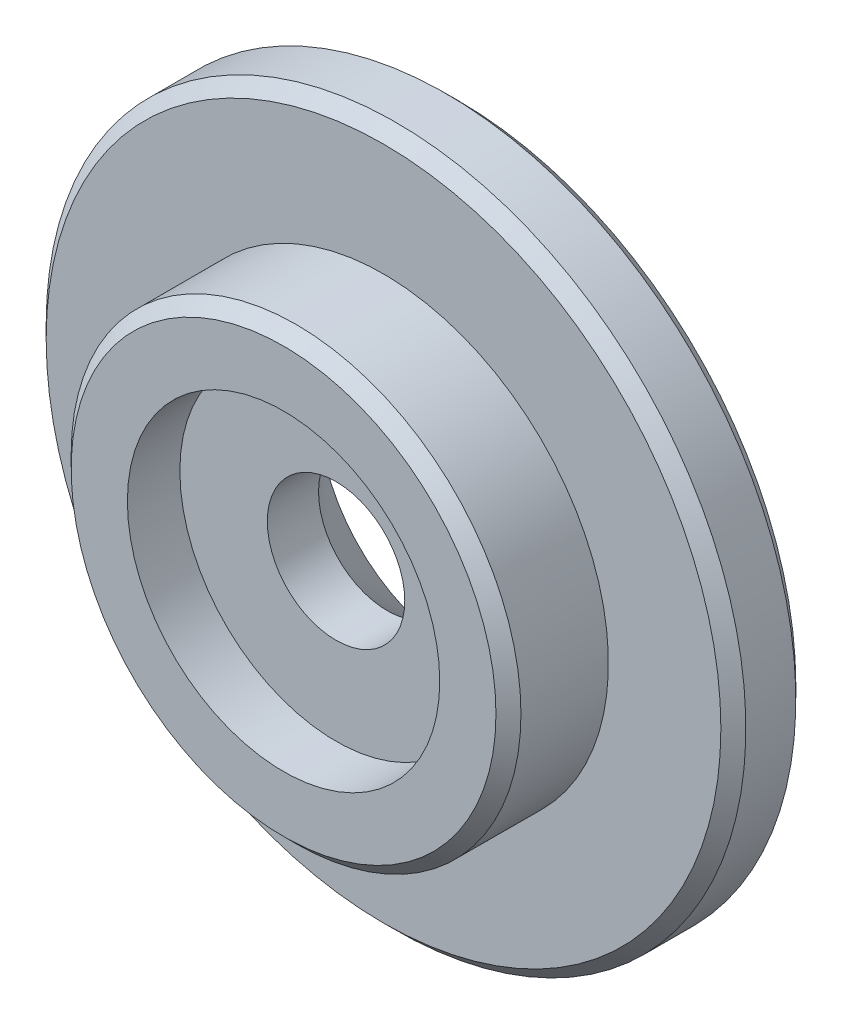
ISO-10303-21;
HEADER;
FILE_DESCRIPTION(('STEP AP214'),'2;1');
FILE_NAME('part.step','',(''),(''),'','','');
FILE_SCHEMA(('AUTOMOTIVE_DESIGN { 1 0 10303 214 1 1 1 1 }'));
ENDSEC;
DATA;
#1=APPLICATION_CONTEXT('core data for automotive mechanical design processes');
#2=APPLICATION_PROTOCOL_DEFINITION('international standard','automotive_design',2000,#1);
#3=PRODUCT_CONTEXT('',#1,'mechanical');
#4=PRODUCT('Part','Part','',(#3));
#5=PRODUCT_RELATED_PRODUCT_CATEGORY('part','',(#4));
#6=PRODUCT_DEFINITION_FORMATION('','',#4);
#7=PRODUCT_DEFINITION_CONTEXT('part definition',#1,'design');
#8=PRODUCT_DEFINITION('design','',#6,#7);
#9=PRODUCT_DEFINITION_SHAPE('','',#8);
#10=(LENGTH_UNIT() NAMED_UNIT(*) SI_UNIT(.MILLI.,.METRE.));
#11=(NAMED_UNIT(*) PLANE_ANGLE_UNIT() SI_UNIT($,.RADIAN.));
#12=(NAMED_UNIT(*) SI_UNIT($,.STERADIAN.) SOLID_ANGLE_UNIT());
#13=UNCERTAINTY_MEASURE_WITH_UNIT(LENGTH_MEASURE(1.E-05),#10,'distance_accuracy_value','');
#14=(GEOMETRIC_REPRESENTATION_CONTEXT(3) GLOBAL_UNCERTAINTY_ASSIGNED_CONTEXT((#13)) GLOBAL_UNIT_ASSIGNED_CONTEXT((#10,
#11,#12)) REPRESENTATION_CONTEXT('',''));
#15=CARTESIAN_POINT('',(0.,0.,0.));
#16=DIRECTION('',(0.,0.,1.));
#17=DIRECTION('',(1.,0.,0.));
#18=AXIS2_PLACEMENT_3D('',#15,#16,#17);
#19=CARTESIAN_POINT('',(0.,0.,4.));
#20=DIRECTION('',(0.,0.,-1.));
#21=DIRECTION('',(-1.,0.,0.));
#22=AXIS2_PLACEMENT_3D('',#19,#20,#21);
#23=CYLINDRICAL_SURFACE('',#22,9.);
#24=CARTESIAN_POINT('',(0.,0.,3.49999999999999));
#25=DIRECTION('',(0.,0.,1.));
#26=DIRECTION('',(1.,0.,0.));
#27=AXIS2_PLACEMENT_3D('',#24,#25,#26);
#28=CIRCLE('',#27,9.);
#29=CARTESIAN_POINT('',(9.,0.,3.49999999999999));
#30=VERTEX_POINT('',#29);
#31=EDGE_CURVE('E11',#30,#30,#28,.F.);
#32=ORIENTED_EDGE('',*,*,#31,.T.);
#33=EDGE_LOOP('',(#32));
#34=FACE_BOUND('',#33,.T.);
#35=CARTESIAN_POINT('',(0.,0.,0.));
#36=DIRECTION('',(0.,0.,-1.));
#37=DIRECTION('',(-1.,0.,0.));
#38=AXIS2_PLACEMENT_3D('',#35,#36,#37);
#39=CIRCLE('',#38,9.);
#40=CARTESIAN_POINT('',(-9.,0.,0.));
#41=VERTEX_POINT('',#40);
#42=EDGE_CURVE('E70',#41,#41,#39,.T.);
#43=ORIENTED_EDGE('',*,*,#42,.F.);
#44=EDGE_LOOP('',(#43));
#45=FACE_BOUND('',#44,.T.);
#46=ADVANCED_FACE('F44',(#34,#45),#23,.T.);
#47=CARTESIAN_POINT('',(0.,0.,4.));
#48=DIRECTION('',(0.,0.,1.));
#49=DIRECTION('',(1.,0.,0.));
#50=AXIS2_PLACEMENT_3D('',#47,#48,#49);
#51=PLANE('',#50);
#52=CARTESIAN_POINT('',(0.,0.,4.));
#53=DIRECTION('',(0.,0.,1.));
#54=DIRECTION('',(1.,0.,0.));
#55=AXIS2_PLACEMENT_3D('',#52,#53,#54);
#56=CIRCLE('',#55,8.49999999999999);
#57=CARTESIAN_POINT('',(8.49999999999999,0.,4.));
#58=VERTEX_POINT('',#57);
#59=EDGE_CURVE('E51',#58,#58,#56,.T.);
#60=ORIENTED_EDGE('',*,*,#59,.T.);
#61=EDGE_LOOP('',(#60));
#62=FACE_BOUND('',#61,.T.);
#63=CARTESIAN_POINT('',(0.,0.,4.));
#64=DIRECTION('',(0.,0.,1.));
#65=DIRECTION('',(1.,0.,0.));
#66=AXIS2_PLACEMENT_3D('',#63,#64,#65);
#67=CIRCLE('',#66,6.25);
#68=CARTESIAN_POINT('',(6.25,0.,4.));
#69=VERTEX_POINT('',#68);
#70=EDGE_CURVE('E74',#69,#69,#67,.T.);
#71=ORIENTED_EDGE('',*,*,#70,.F.);
#72=EDGE_LOOP('',(#71));
#73=FACE_BOUND('',#72,.T.);
#74=ADVANCED_FACE('F109',(#62,#73),#51,.T.);
#75=CARTESIAN_POINT('',(0.,0.,0.));
#76=DIRECTION('',(0.,0.,-1.));
#77=DIRECTION('',(-1.,0.,0.));
#78=AXIS2_PLACEMENT_3D('',#75,#76,#77);
#79=PLANE('',#78);
#80=CARTESIAN_POINT('',(0.,0.,0.));
#81=DIRECTION('',(0.,0.,-1.));
#82=DIRECTION('',(-1.,0.,0.));
#83=AXIS2_PLACEMENT_3D('',#80,#81,#82);
#84=CIRCLE('',#83,13.5);
#85=CARTESIAN_POINT('',(-13.5,0.,0.));
#86=VERTEX_POINT('',#85);
#87=EDGE_CURVE('E55',#86,#86,#84,.F.);
#88=ORIENTED_EDGE('',*,*,#87,.T.);
#89=EDGE_LOOP('',(#88));
#90=FACE_BOUND('',#89,.T.);
#91=ORIENTED_EDGE('',*,*,#42,.T.);
#92=EDGE_LOOP('',(#91));
#93=FACE_BOUND('',#92,.T.);
#94=ADVANCED_FACE('F104',(#90,#93),#79,.F.);
#95=CARTESIAN_POINT('',(0.,0.,-3.));
#96=DIRECTION('',(0.,0.,1.));
#97=DIRECTION('',(1.,0.,0.));
#98=AXIS2_PLACEMENT_3D('',#95,#96,#97);
#99=CYLINDRICAL_SURFACE('',#98,14.);
#100=CARTESIAN_POINT('',(0.,0.,-2.5));
#101=DIRECTION('',(0.,0.,-1.));
#102=DIRECTION('',(-1.,0.,0.));
#103=AXIS2_PLACEMENT_3D('',#100,#101,#102);
#104=CIRCLE('',#103,14.);
#105=CARTESIAN_POINT('',(-14.,0.,-2.5));
#106=VERTEX_POINT('',#105);
#107=EDGE_CURVE('E59',#106,#106,#104,.F.);
#108=ORIENTED_EDGE('',*,*,#107,.T.);
#109=EDGE_LOOP('',(#108));
#110=FACE_BOUND('',#109,.T.);
#111=CARTESIAN_POINT('',(0.,0.,-0.5));
#112=DIRECTION('',(0.,0.,-1.));
#113=DIRECTION('',(-1.,0.,0.));
#114=AXIS2_PLACEMENT_3D('',#111,#112,#113);
#115=CIRCLE('',#114,14.);
#116=CARTESIAN_POINT('',(-14.,0.,-0.5));
#117=VERTEX_POINT('',#116);
#118=EDGE_CURVE('E64',#117,#117,#115,.T.);
#119=ORIENTED_EDGE('',*,*,#118,.T.);
#120=EDGE_LOOP('',(#119));
#121=FACE_BOUND('',#120,.T.);
#122=ADVANCED_FACE('F94',(#110,#121),#99,.T.);
#123=CARTESIAN_POINT('',(0.,0.,-3.));
#124=DIRECTION('',(0.,0.,-1.));
#125=DIRECTION('',(-1.,0.,0.));
#126=AXIS2_PLACEMENT_3D('',#123,#124,#125);
#127=PLANE('',#126);
#128=CARTESIAN_POINT('',(0.,0.,-3.));
#129=DIRECTION('',(0.,0.,-1.));
#130=DIRECTION('',(-1.,0.,0.));
#131=AXIS2_PLACEMENT_3D('',#128,#129,#130);
#132=CIRCLE('',#131,13.5);
#133=CARTESIAN_POINT('',(-13.5,0.,-3.));
#134=VERTEX_POINT('',#133);
#135=EDGE_CURVE('E67',#134,#134,#132,.T.);
#136=ORIENTED_EDGE('',*,*,#135,.T.);
#137=EDGE_LOOP('',(#136));
#138=FACE_BOUND('',#137,.T.);
#139=CARTESIAN_POINT('',(0.,0.,-3.));
#140=DIRECTION('',(0.,0.,-1.));
#141=DIRECTION('',(-1.,0.,0.));
#142=AXIS2_PLACEMENT_3D('',#139,#140,#141);
#143=CIRCLE('',#142,5.6);
#144=CARTESIAN_POINT('',(-5.6,0.,-3.));
#145=VERTEX_POINT('',#144);
#146=EDGE_CURVE('E85',#145,#145,#143,.T.);
#147=ORIENTED_EDGE('',*,*,#146,.F.);
#148=EDGE_LOOP('',(#147));
#149=FACE_BOUND('',#148,.T.);
#150=ADVANCED_FACE('F91',(#138,#149),#127,.T.);
#151=CARTESIAN_POINT('',(0.,0.,1.9));
#152=DIRECTION('',(0.,0.,1.));
#153=DIRECTION('',(1.,0.,0.));
#154=AXIS2_PLACEMENT_3D('',#151,#152,#153);
#155=CYLINDRICAL_SURFACE('',#154,6.25);
#156=CARTESIAN_POINT('',(0.,0.,1.9));
#157=DIRECTION('',(0.,0.,1.));
#158=DIRECTION('',(1.,0.,0.));
#159=AXIS2_PLACEMENT_3D('',#156,#157,#158);
#160=CIRCLE('',#159,6.25);
#161=CARTESIAN_POINT('',(6.25,0.,1.9));
#162=VERTEX_POINT('',#161);
#163=EDGE_CURVE('E78',#162,#162,#160,.T.);
#164=ORIENTED_EDGE('',*,*,#163,.F.);
#165=EDGE_LOOP('',(#164));
#166=FACE_BOUND('',#165,.T.);
#167=ORIENTED_EDGE('',*,*,#70,.T.);
#168=EDGE_LOOP('',(#167));
#169=FACE_BOUND('',#168,.T.);
#170=ADVANCED_FACE('F93',(#166,#169),#155,.F.);
#171=CARTESIAN_POINT('',(0.,0.,1.9));
#172=DIRECTION('',(0.,0.,1.));
#173=DIRECTION('',(1.,0.,0.));
#174=AXIS2_PLACEMENT_3D('',#171,#172,#173);
#175=PLANE('',#174);
#176=CARTESIAN_POINT('',(0.,0.,1.9));
#177=DIRECTION('',(0.,0.,1.));
#178=DIRECTION('',(1.,0.,0.));
#179=AXIS2_PLACEMENT_3D('',#176,#177,#178);
#180=CIRCLE('',#179,2.75);
#181=CARTESIAN_POINT('',(2.75,0.,1.9));
#182=VERTEX_POINT('',#181);
#183=EDGE_CURVE('E71',#182,#182,#180,.T.);
#184=ORIENTED_EDGE('',*,*,#183,.F.);
#185=EDGE_LOOP('',(#184));
#186=FACE_BOUND('',#185,.T.);
#187=ORIENTED_EDGE('',*,*,#163,.T.);
#188=EDGE_LOOP('',(#187));
#189=FACE_BOUND('',#188,.T.);
#190=ADVANCED_FACE('F101',(#186,#189),#175,.T.);
#191=CARTESIAN_POINT('',(0.,0.,-3.));
#192=DIRECTION('',(0.,0.,-1.));
#193=DIRECTION('',(-1.,0.,0.));
#194=AXIS2_PLACEMENT_3D('',#191,#192,#193);
#195=CYLINDRICAL_SURFACE('',#194,2.75);
#196=ORIENTED_EDGE('',*,*,#183,.T.);
#197=EDGE_LOOP('',(#196));
#198=FACE_BOUND('',#197,.T.);
#199=CARTESIAN_POINT('',(0.,0.,-0.149999999999997));
#200=DIRECTION('',(0.,0.,-1.));
#201=DIRECTION('',(-1.,0.,0.));
#202=AXIS2_PLACEMENT_3D('',#199,#200,#201);
#203=CIRCLE('',#202,2.75);
#204=CARTESIAN_POINT('',(-2.75,0.,-0.149999999999997));
#205=VERTEX_POINT('',#204);
#206=EDGE_CURVE('E75',#205,#205,#203,.T.);
#207=ORIENTED_EDGE('',*,*,#206,.T.);
#208=EDGE_LOOP('',(#207));
#209=FACE_BOUND('',#208,.T.);
#210=ADVANCED_FACE('F162',(#198,#209),#195,.F.);
#211=CARTESIAN_POINT('',(0.,0.,-3.));
#212=DIRECTION('',(0.,0.,-1.));
#213=DIRECTION('',(-1.,0.,0.));
#214=AXIS2_PLACEMENT_3D('',#211,#212,#213);
#215=CONICAL_SURFACE('',#214,5.6,0.785398163397449);
#216=ORIENTED_EDGE('',*,*,#206,.F.);
#217=EDGE_LOOP('',(#216));
#218=FACE_BOUND('',#217,.T.);
#219=ORIENTED_EDGE('',*,*,#146,.T.);
#220=EDGE_LOOP('',(#219));
#221=FACE_BOUND('',#220,.T.);
#222=ADVANCED_FACE('F89',(#218,#221),#215,.F.);
#223=CARTESIAN_POINT('',(0.,0.,-3.));
#224=DIRECTION('',(0.,0.,1.));
#225=DIRECTION('',(1.,0.,0.));
#226=AXIS2_PLACEMENT_3D('',#223,#224,#225);
#227=CONICAL_SURFACE('',#226,13.5,0.785398163397447);
#228=ORIENTED_EDGE('',*,*,#107,.F.);
#229=EDGE_LOOP('',(#228));
#230=FACE_BOUND('',#229,.T.);
#231=ORIENTED_EDGE('',*,*,#135,.F.);
#232=EDGE_LOOP('',(#231));
#233=FACE_BOUND('',#232,.T.);
#234=ADVANCED_FACE('F117',(#230,#233),#227,.T.);
#235=CARTESIAN_POINT('',(0.,0.,-0.5));
#236=DIRECTION('',(0.,0.,-1.));
#237=DIRECTION('',(-1.,0.,0.));
#238=AXIS2_PLACEMENT_3D('',#235,#236,#237);
#239=CONICAL_SURFACE('',#238,14.,0.78539816339745);
#240=ORIENTED_EDGE('',*,*,#87,.F.);
#241=EDGE_LOOP('',(#240));
#242=FACE_BOUND('',#241,.T.);
#243=ORIENTED_EDGE('',*,*,#118,.F.);
#244=EDGE_LOOP('',(#243));
#245=FACE_BOUND('',#244,.T.);
#246=ADVANCED_FACE('F119',(#242,#245),#239,.T.);
#247=CARTESIAN_POINT('',(0.,0.,4.));
#248=DIRECTION('',(0.,0.,-1.));
#249=DIRECTION('',(-1.,0.,0.));
#250=AXIS2_PLACEMENT_3D('',#247,#248,#249);
#251=CONICAL_SURFACE('',#250,8.49999999999999,0.78539816339745);
#252=ORIENTED_EDGE('',*,*,#31,.F.);
#253=EDGE_LOOP('',(#252));
#254=FACE_BOUND('',#253,.T.);
#255=ORIENTED_EDGE('',*,*,#59,.F.);
#256=EDGE_LOOP('',(#255));
#257=FACE_BOUND('',#256,.T.);
#258=ADVANCED_FACE('F46',(#254,#257),#251,.T.);
#259=CLOSED_SHELL('',(#46,#74,#94,#122,#150,#170,#190,#210,#222,#234,#246,#258));
#260=MANIFOLD_SOLID_BREP('B2',#259);
#261=ADVANCED_BREP_SHAPE_REPRESENTATION('',(#18,#260),#14);
#262=SHAPE_DEFINITION_REPRESENTATION(#9,#261);
ENDSEC;
END-ISO-10303-21;
